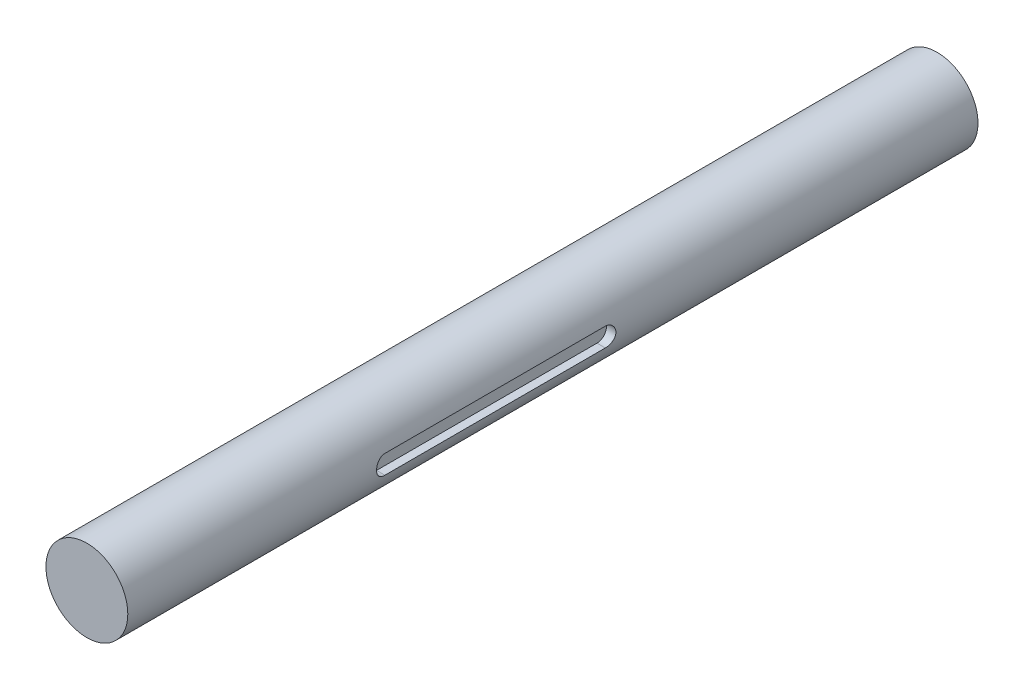
ISO-10303-21;
HEADER;
FILE_DESCRIPTION(('STEP AP214'),'2;1');
FILE_NAME('part.step','',(''),(''),'','','');
FILE_SCHEMA(('AUTOMOTIVE_DESIGN { 1 0 10303 214 1 1 1 1 }'));
ENDSEC;
DATA;
#1=APPLICATION_CONTEXT('core data for automotive mechanical design processes');
#2=APPLICATION_PROTOCOL_DEFINITION('international standard','automotive_design',2000,#1);
#3=PRODUCT_CONTEXT('',#1,'mechanical');
#4=PRODUCT('Part','Part','',(#3));
#5=PRODUCT_RELATED_PRODUCT_CATEGORY('part','',(#4));
#6=PRODUCT_DEFINITION_FORMATION('','',#4);
#7=PRODUCT_DEFINITION_CONTEXT('part definition',#1,'design');
#8=PRODUCT_DEFINITION('design','',#6,#7);
#9=PRODUCT_DEFINITION_SHAPE('','',#8);
#10=(LENGTH_UNIT() NAMED_UNIT(*) SI_UNIT(.MILLI.,.METRE.));
#11=(NAMED_UNIT(*) PLANE_ANGLE_UNIT() SI_UNIT($,.RADIAN.));
#12=(NAMED_UNIT(*) SI_UNIT($,.STERADIAN.) SOLID_ANGLE_UNIT());
#13=UNCERTAINTY_MEASURE_WITH_UNIT(LENGTH_MEASURE(1.E-05),#10,'distance_accuracy_value','');
#14=(GEOMETRIC_REPRESENTATION_CONTEXT(3) GLOBAL_UNCERTAINTY_ASSIGNED_CONTEXT((#13)) GLOBAL_UNIT_ASSIGNED_CONTEXT((#10,
#11,#12)) REPRESENTATION_CONTEXT('',''));
#15=CARTESIAN_POINT('',(0.,0.,0.));
#16=DIRECTION('',(0.,0.,1.));
#17=DIRECTION('',(1.,0.,0.));
#18=AXIS2_PLACEMENT_3D('',#15,#16,#17);
#19=CARTESIAN_POINT('',(0.,0.,67.5));
#20=DIRECTION('',(0.,0.,-1.));
#21=DIRECTION('',(-1.,0.,0.));
#22=AXIS2_PLACEMENT_3D('',#19,#20,#21);
#23=CYLINDRICAL_SURFACE('',#22,6.5);
#24=DIRECTION('',(0.,0.,-1.));
#25=VECTOR('',#24,1.);
#26=CARTESIAN_POINT('',(6.32455532033676,1.50000000000001,67.5));
#27=LINE('',#26,#25);
#28=CARTESIAN_POINT('',(6.32455532033676,1.50000000000001,26.5));
#29=VERTEX_POINT('',#28);
#30=CARTESIAN_POINT('',(6.32455532033676,1.50000000000001,-8.49999999999999));
#31=VERTEX_POINT('',#30);
#32=EDGE_CURVE('E11',#29,#31,#27,.T.);
#33=ORIENTED_EDGE('',*,*,#32,.T.);
#34=CARTESIAN_POINT('',(6.32455532033676,1.50000000000001,-8.49999999999999));
#35=CARTESIAN_POINT('',(6.32455278645458,1.50000038971591,-8.54159982889928));
#36=CARTESIAN_POINT('',(6.32496627744665,1.4982683537092,-8.58317915359802));
#37=CARTESIAN_POINT('',(6.32659902775375,1.49136295006507,-8.66602892637271));
#38=CARTESIAN_POINT('',(6.32781816638021,1.48619009787211,-8.70729941977623));
#39=CARTESIAN_POINT('',(6.33263622957867,1.46558161125345,-8.83004547533652));
#40=CARTESIAN_POINT('',(6.33739607944304,1.44505575125107,-8.91068087304222));
#41=CARTESIAN_POINT('',(6.34946063570246,1.39108012165164,-9.06724208415837));
#42=CARTESIAN_POINT('',(6.356765317996,1.35763047445235,-9.14316794216372));
#43=CARTESIAN_POINT('',(6.3730924529069,1.27879155746829,-9.28836231208182));
#44=CARTESIAN_POINT('',(6.38211525054266,1.23339988888097,-9.35762948263802));
#45=CARTESIAN_POINT('',(6.40104930263698,1.1310671760673,-9.48879881288929));
#46=CARTESIAN_POINT('',(6.41097291066097,1.07394535730117,-9.55055811915533));
#47=CARTESIAN_POINT('',(6.43048361215167,0.950157992588206,-9.66371504130735));
#48=CARTESIAN_POINT('',(6.44007065240712,0.883490945929519,-9.7151110247938));
#49=CARTESIAN_POINT('',(6.45796352858461,0.741536676715971,-9.80665148672902));
#50=CARTESIAN_POINT('',(6.46625296983543,0.666157292156167,-9.84665652429079));
#51=CARTESIAN_POINT('',(6.48047517536362,0.509525632737839,-9.91337421123081));
#52=CARTESIAN_POINT('',(6.48640835576748,0.428274397873569,-9.94008920790211));
#53=CARTESIAN_POINT('',(6.49516223081651,0.263699065180437,-9.97901594961624));
#54=CARTESIAN_POINT('',(6.49803517522939,0.180435447484206,-9.99147144381803));
#55=CARTESIAN_POINT('',(6.50052632844959,0.0129523388305181,-10.0022889281008));
#56=CARTESIAN_POINT('',(6.50014487636923,-0.0712670516208808,-10.0006523865899));
#57=CARTESIAN_POINT('',(6.49620963836218,-0.236582963908397,-9.98351095027081));
#58=CARTESIAN_POINT('',(6.49271605899016,-0.317708421693402,-9.96826924669965));
#59=CARTESIAN_POINT('',(6.48301829655288,-0.476217226836856,-9.92477103381857));
#60=CARTESIAN_POINT('',(6.47681400474456,-0.553600423932271,-9.89651400238272));
#61=CARTESIAN_POINT('',(6.46229675441755,-0.703146651792265,-9.82756147986291));
#62=CARTESIAN_POINT('',(6.45396732909902,-0.775262986246887,-9.78676832211644));
#63=CARTESIAN_POINT('',(6.43610990105884,-0.911719232114348,-9.69397571856972));
#64=CARTESIAN_POINT('',(6.42658175032139,-0.976058181266888,-9.64197488830596));
#65=CARTESIAN_POINT('',(6.40711194573099,-1.09669562202188,-9.52682553019207));
#66=CARTESIAN_POINT('',(6.39716582216584,-1.15277494172637,-9.46344794974811));
#67=CARTESIAN_POINT('',(6.37818224621644,-1.25356704085918,-9.32806489203154));
#68=CARTESIAN_POINT('',(6.36914504249332,-1.29827671487999,-9.25605706545203));
#69=CARTESIAN_POINT('',(6.35298728782606,-1.37517593070668,-9.10506420224678));
#70=CARTESIAN_POINT('',(6.34587484204239,-1.40731277367255,-9.02605146506283));
#71=CARTESIAN_POINT('',(6.33448258115112,-1.45774142900931,-8.86359142688997));
#72=CARTESIAN_POINT('',(6.33019854568115,-1.47605387509275,-8.78015093462167));
#73=CARTESIAN_POINT('',(6.32657992397422,-1.49144181512835,-8.66334152195379));
#74=CARTESIAN_POINT('',(6.32582172403652,-1.49465193742684,-8.63073264452387));
#75=CARTESIAN_POINT('',(6.32480973177627,-1.49892849366983,-8.56542090340764));
#76=CARTESIAN_POINT('',(6.32455510849446,-1.49999845915187,-8.532718283878));
#77=CARTESIAN_POINT('',(6.32455532033676,-1.49999999999999,-8.5));
#78=B_SPLINE_CURVE_WITH_KNOTS('',3,(#34,#35,#36,#37,#38,#39,#40,#41,#42,#43,#44,#45,#46,#47,#48,
#49,#50,#51,#52,#53,#54,#55,#56,#57,#58,#59,#60,#61,#62,#63,#64,#65,#66,#67,#68,#69,#70,#71,#72,
#73,#74,#75,#76,#77),.UNSPECIFIED.,.F.,.F.,(4,2,2,2,2,2,2,2,2,2,2,2,2,2,2,2,2,2,2,2,2,4),(0.,
0.124720994841882,0.249423310315585,0.498160949664346,0.746896233342379,0.995681518856719,
1.24863538926291,1.50162907313144,1.75759827228624,2.01352224598006,2.26500293084808,
2.51645741142431,2.76315047124259,3.00985342831941,3.25852933881127,3.50723598541254,
3.761667543539,4.01616852046003,4.27172508967233,4.52689946764138,4.62516695222622,
4.72327214844352),.UNSPECIFIED.);
#79=CARTESIAN_POINT('',(6.32455532033676,-1.49999999999999,-8.49999999999999));
#80=VERTEX_POINT('',#79);
#81=EDGE_CURVE('E108',#31,#80,#78,.T.);
#82=ORIENTED_EDGE('',*,*,#81,.T.);
#83=DIRECTION('',(0.,0.,-1.));
#84=VECTOR('',#83,1.);
#85=CARTESIAN_POINT('',(6.32455532033676,-1.49999999999999,67.5));
#86=LINE('',#85,#84);
#87=CARTESIAN_POINT('',(6.32455532033676,-1.49999999999999,26.5));
#88=VERTEX_POINT('',#87);
#89=EDGE_CURVE('E43',#80,#88,#86,.F.);
#90=ORIENTED_EDGE('',*,*,#89,.T.);
#91=CARTESIAN_POINT('',(6.32455532033676,-1.49999999999999,26.5));
#92=CARTESIAN_POINT('',(6.32455278645458,-1.5000003897159,26.5415998288993));
#93=CARTESIAN_POINT('',(6.32496627744665,-1.49826835370919,26.583179153598));
#94=CARTESIAN_POINT('',(6.32659902775376,-1.49136295006505,26.6660289263727));
#95=CARTESIAN_POINT('',(6.32781816638021,-1.4861900978721,26.7072994197762));
#96=CARTESIAN_POINT('',(6.33263622957867,-1.46558161125344,26.8300454753365));
#97=CARTESIAN_POINT('',(6.33739607944305,-1.44505575125106,26.9106808730422));
#98=CARTESIAN_POINT('',(6.34946063570246,-1.39108012165163,27.0672420841584));
#99=CARTESIAN_POINT('',(6.356765317996,-1.35763047445234,27.1431679421637));
#100=CARTESIAN_POINT('',(6.3730924529069,-1.27879155746828,27.2883623120818));
#101=CARTESIAN_POINT('',(6.38211525054266,-1.23339988888096,27.357629482638));
#102=CARTESIAN_POINT('',(6.40104930263698,-1.13106717606729,27.4887988128893));
#103=CARTESIAN_POINT('',(6.41097291066097,-1.07394535730116,27.5505581191553));
#104=CARTESIAN_POINT('',(6.43048361215167,-0.950157992588197,27.6637150413074));
#105=CARTESIAN_POINT('',(6.44007065240712,-0.883490945929509,27.7151110247938));
#106=CARTESIAN_POINT('',(6.45796352858461,-0.741536676715962,27.806651486729));
#107=CARTESIAN_POINT('',(6.46625296983543,-0.666157292156157,27.8466565242908));
#108=CARTESIAN_POINT('',(6.48047517536362,-0.50952563273783,27.9133742112308));
#109=CARTESIAN_POINT('',(6.48640835576748,-0.428274397873559,27.9400892079021));
#110=CARTESIAN_POINT('',(6.49516223081651,-0.263699065180427,27.9790159496163));
#111=CARTESIAN_POINT('',(6.49803517522939,-0.180435447484195,27.9914714438181));
#112=CARTESIAN_POINT('',(6.50052632844959,-0.0129523388305079,28.0022889281008));
#113=CARTESIAN_POINT('',(6.50014487636923,0.0712670516208909,28.0006523865899));
#114=CARTESIAN_POINT('',(6.49620963836218,0.236582963908407,27.9835109502708));
#115=CARTESIAN_POINT('',(6.49271605899016,0.317708421693411,27.9682692466997));
#116=CARTESIAN_POINT('',(6.48301829655288,0.476217226836865,27.9247710338186));
#117=CARTESIAN_POINT('',(6.47681400474456,0.553600423932281,27.8965140023827));
#118=CARTESIAN_POINT('',(6.46229675441755,0.703146651792275,27.8275614798629));
#119=CARTESIAN_POINT('',(6.45396732909901,0.775262986246896,27.7867683221165));
#120=CARTESIAN_POINT('',(6.43610990105884,0.911719232114358,27.6939757185697));
#121=CARTESIAN_POINT('',(6.42658175032139,0.976058181266898,27.641974888306));
#122=CARTESIAN_POINT('',(6.40711194573099,1.09669562202189,27.5268255301921));
#123=CARTESIAN_POINT('',(6.39716582216584,1.15277494172638,27.4634479497481));
#124=CARTESIAN_POINT('',(6.37818224621644,1.25356704085919,27.3280648920316));
#125=CARTESIAN_POINT('',(6.36914504249332,1.29827671488,27.2560570654521));
#126=CARTESIAN_POINT('',(6.35298728782606,1.37517593070669,27.1050642022468));
#127=CARTESIAN_POINT('',(6.34587484204238,1.40731277367256,27.0260514650629));
#128=CARTESIAN_POINT('',(6.33448258115112,1.45774142900932,26.86359142689));
#129=CARTESIAN_POINT('',(6.33019854568114,1.47605387509276,26.7801509346217));
#130=CARTESIAN_POINT('',(6.32657992397422,1.49144181512836,26.6633415219538));
#131=CARTESIAN_POINT('',(6.32582172403651,1.49465193742686,26.6307326445239));
#132=CARTESIAN_POINT('',(6.32480973177627,1.49892849366984,26.5654209034077));
#133=CARTESIAN_POINT('',(6.32455510849446,1.49999845915188,26.532718283878));
#134=CARTESIAN_POINT('',(6.32455532033676,1.50000000000001,26.5));
#135=B_SPLINE_CURVE_WITH_KNOTS('',3,(#91,#92,#93,#94,#95,#96,#97,#98,#99,#100,#101,#102,#103,
#104,#105,#106,#107,#108,#109,#110,#111,#112,#113,#114,#115,#116,#117,#118,#119,#120,#121,#122,
#123,#124,#125,#126,#127,#128,#129,#130,#131,#132,#133,#134),.UNSPECIFIED.,.F.,.F.,(4,2,2,2,2,2,
2,2,2,2,2,2,2,2,2,2,2,2,2,2,2,4),(0.,0.124720994841883,0.249423310315585,0.498160949664344,
0.746896233342378,0.99568151885672,1.24863538926291,1.50162907313143,1.75759827228624,
2.01352224598006,2.26500293084808,2.51645741142431,2.76315047124259,3.00985342831941,
3.25852933881127,3.50723598541254,3.761667543539,4.01616852046002,4.27172508967233,
4.52689946764138,4.62516695222622,4.72327214844352),.UNSPECIFIED.);
#136=EDGE_CURVE('E50',#88,#29,#135,.T.);
#137=ORIENTED_EDGE('',*,*,#136,.T.);
#138=EDGE_LOOP('',(#33,#82,#90,#137));
#139=FACE_BOUND('',#138,.T.);
#140=CARTESIAN_POINT('',(0.,0.,67.5));
#141=DIRECTION('',(0.,0.,1.));
#142=DIRECTION('',(1.,0.,0.));
#143=AXIS2_PLACEMENT_3D('',#140,#141,#142);
#144=CIRCLE('',#143,6.5);
#145=CARTESIAN_POINT('',(6.5,0.,67.5));
#146=VERTEX_POINT('',#145);
#147=EDGE_CURVE('E105',#146,#146,#144,.T.);
#148=ORIENTED_EDGE('',*,*,#147,.F.);
#149=EDGE_LOOP('',(#148));
#150=FACE_BOUND('',#149,.T.);
#151=CARTESIAN_POINT('',(0.,0.,-67.5));
#152=DIRECTION('',(0.,0.,1.));
#153=DIRECTION('',(1.,0.,0.));
#154=AXIS2_PLACEMENT_3D('',#151,#152,#153);
#155=CIRCLE('',#154,6.5);
#156=CARTESIAN_POINT('',(6.5,0.,-67.5));
#157=VERTEX_POINT('',#156);
#158=EDGE_CURVE('E101',#157,#157,#155,.T.);
#159=ORIENTED_EDGE('',*,*,#158,.T.);
#160=EDGE_LOOP('',(#159));
#161=FACE_BOUND('',#160,.T.);
#162=ADVANCED_FACE('F35',(#139,#150,#161),#23,.T.);
#163=CARTESIAN_POINT('',(0.,0.,67.5));
#164=DIRECTION('',(0.,0.,1.));
#165=DIRECTION('',(1.,0.,0.));
#166=AXIS2_PLACEMENT_3D('',#163,#164,#165);
#167=PLANE('',#166);
#168=ORIENTED_EDGE('',*,*,#147,.T.);
#169=EDGE_LOOP('',(#168));
#170=FACE_BOUND('',#169,.T.);
#171=ADVANCED_FACE('F136',(#170),#167,.T.);
#172=CARTESIAN_POINT('',(0.,0.,-67.5));
#173=DIRECTION('',(0.,0.,1.));
#174=DIRECTION('',(1.,0.,0.));
#175=AXIS2_PLACEMENT_3D('',#172,#173,#174);
#176=PLANE('',#175);
#177=ORIENTED_EDGE('',*,*,#158,.F.);
#178=EDGE_LOOP('',(#177));
#179=FACE_BOUND('',#178,.T.);
#180=ADVANCED_FACE('F135',(#179),#176,.F.);
#181=CARTESIAN_POINT('',(5.,0.,26.5));
#182=DIRECTION('',(1.,0.,0.));
#183=DIRECTION('',(0.,0.,-1.));
#184=AXIS2_PLACEMENT_3D('',#181,#182,#183);
#185=CYLINDRICAL_SURFACE('',#184,1.5);
#186=DIRECTION('',(1.,0.,0.));
#187=VECTOR('',#186,1.);
#188=CARTESIAN_POINT('',(5.,-1.49999999999999,26.5));
#189=LINE('',#188,#187);
#190=CARTESIAN_POINT('',(5.,-1.49999999999999,26.5));
#191=VERTEX_POINT('',#190);
#192=EDGE_CURVE('E73',#191,#88,#189,.T.);
#193=ORIENTED_EDGE('',*,*,#192,.F.);
#194=CARTESIAN_POINT('',(5.,0.,26.5));
#195=DIRECTION('',(1.,0.,0.));
#196=DIRECTION('',(0.,0.,-1.));
#197=AXIS2_PLACEMENT_3D('',#194,#195,#196);
#198=CIRCLE('',#197,1.5);
#199=CARTESIAN_POINT('',(5.,1.50000000000001,26.5));
#200=VERTEX_POINT('',#199);
#201=EDGE_CURVE('E77',#200,#191,#198,.T.);
#202=ORIENTED_EDGE('',*,*,#201,.F.);
#203=DIRECTION('',(1.,0.,0.));
#204=VECTOR('',#203,1.);
#205=CARTESIAN_POINT('',(5.,1.50000000000001,26.5));
#206=LINE('',#205,#204);
#207=EDGE_CURVE('E99',#200,#29,#206,.T.);
#208=ORIENTED_EDGE('',*,*,#207,.T.);
#209=ORIENTED_EDGE('',*,*,#136,.F.);
#210=EDGE_LOOP('',(#193,#202,#208,#209));
#211=FACE_BOUND('',#210,.T.);
#212=ADVANCED_FACE('F75',(#211),#185,.F.);
#213=CARTESIAN_POINT('',(5.,1.50000000000001,26.5));
#214=DIRECTION('',(0.,1.,0.));
#215=DIRECTION('',(0.,0.,1.));
#216=AXIS2_PLACEMENT_3D('',#213,#214,#215);
#217=PLANE('',#216);
#218=ORIENTED_EDGE('',*,*,#207,.F.);
#219=DIRECTION('',(0.,0.,1.));
#220=VECTOR('',#219,1.);
#221=CARTESIAN_POINT('',(5.,1.50000000000001,26.5));
#222=LINE('',#221,#220);
#223=CARTESIAN_POINT('',(5.,1.50000000000001,-8.49999999999999));
#224=VERTEX_POINT('',#223);
#225=EDGE_CURVE('E82',#224,#200,#222,.T.);
#226=ORIENTED_EDGE('',*,*,#225,.F.);
#227=DIRECTION('',(1.,0.,0.));
#228=VECTOR('',#227,1.);
#229=CARTESIAN_POINT('',(5.,1.50000000000001,-8.49999999999999));
#230=LINE('',#229,#228);
#231=EDGE_CURVE('E102',#224,#31,#230,.T.);
#232=ORIENTED_EDGE('',*,*,#231,.T.);
#233=ORIENTED_EDGE('',*,*,#32,.F.);
#234=EDGE_LOOP('',(#218,#226,#232,#233));
#235=FACE_BOUND('',#234,.T.);
#236=ADVANCED_FACE('F128',(#235),#217,.F.);
#237=CARTESIAN_POINT('',(5.,0.,-8.49999999999999));
#238=DIRECTION('',(1.,0.,0.));
#239=DIRECTION('',(0.,0.,-1.));
#240=AXIS2_PLACEMENT_3D('',#237,#238,#239);
#241=CYLINDRICAL_SURFACE('',#240,1.5);
#242=ORIENTED_EDGE('',*,*,#231,.F.);
#243=CARTESIAN_POINT('',(5.,0.,-8.49999999999999));
#244=DIRECTION('',(1.,0.,0.));
#245=DIRECTION('',(0.,0.,-1.));
#246=AXIS2_PLACEMENT_3D('',#243,#244,#245);
#247=CIRCLE('',#246,1.5);
#248=CARTESIAN_POINT('',(5.,-1.49999999999999,-8.49999999999999));
#249=VERTEX_POINT('',#248);
#250=EDGE_CURVE('E91',#249,#224,#247,.T.);
#251=ORIENTED_EDGE('',*,*,#250,.F.);
#252=DIRECTION('',(1.,0.,0.));
#253=VECTOR('',#252,1.);
#254=CARTESIAN_POINT('',(5.,-1.49999999999999,-8.49999999999999));
#255=LINE('',#254,#253);
#256=EDGE_CURVE('E81',#249,#80,#255,.T.);
#257=ORIENTED_EDGE('',*,*,#256,.T.);
#258=ORIENTED_EDGE('',*,*,#81,.F.);
#259=EDGE_LOOP('',(#242,#251,#257,#258));
#260=FACE_BOUND('',#259,.T.);
#261=ADVANCED_FACE('F123',(#260),#241,.F.);
#262=CARTESIAN_POINT('',(5.,-1.49999999999999,26.5));
#263=DIRECTION('',(0.,-1.,0.));
#264=DIRECTION('',(0.,0.,-1.));
#265=AXIS2_PLACEMENT_3D('',#262,#263,#264);
#266=PLANE('',#265);
#267=ORIENTED_EDGE('',*,*,#256,.F.);
#268=DIRECTION('',(0.,0.,-1.));
#269=VECTOR('',#268,1.);
#270=CARTESIAN_POINT('',(5.,-1.49999999999999,26.5));
#271=LINE('',#270,#269);
#272=EDGE_CURVE('E85',#191,#249,#271,.T.);
#273=ORIENTED_EDGE('',*,*,#272,.F.);
#274=ORIENTED_EDGE('',*,*,#192,.T.);
#275=ORIENTED_EDGE('',*,*,#89,.F.);
#276=EDGE_LOOP('',(#267,#273,#274,#275));
#277=FACE_BOUND('',#276,.T.);
#278=ADVANCED_FACE('F86',(#277),#266,.F.);
#279=CARTESIAN_POINT('',(5.,0.,26.5));
#280=DIRECTION('',(1.,0.,0.));
#281=DIRECTION('',(0.,0.,-1.));
#282=AXIS2_PLACEMENT_3D('',#279,#280,#281);
#283=PLANE('',#282);
#284=ORIENTED_EDGE('',*,*,#201,.T.);
#285=ORIENTED_EDGE('',*,*,#272,.T.);
#286=ORIENTED_EDGE('',*,*,#250,.T.);
#287=ORIENTED_EDGE('',*,*,#225,.T.);
#288=EDGE_LOOP('',(#284,#285,#286,#287));
#289=FACE_BOUND('',#288,.T.);
#290=ADVANCED_FACE('F93',(#289),#283,.T.);
#291=CLOSED_SHELL('',(#162,#171,#180,#212,#236,#261,#278,#290));
#292=MANIFOLD_SOLID_BREP('B2',#291);
#293=ADVANCED_BREP_SHAPE_REPRESENTATION('',(#18,#292),#14);
#294=SHAPE_DEFINITION_REPRESENTATION(#9,#293);
ENDSEC;
END-ISO-10303-21;
